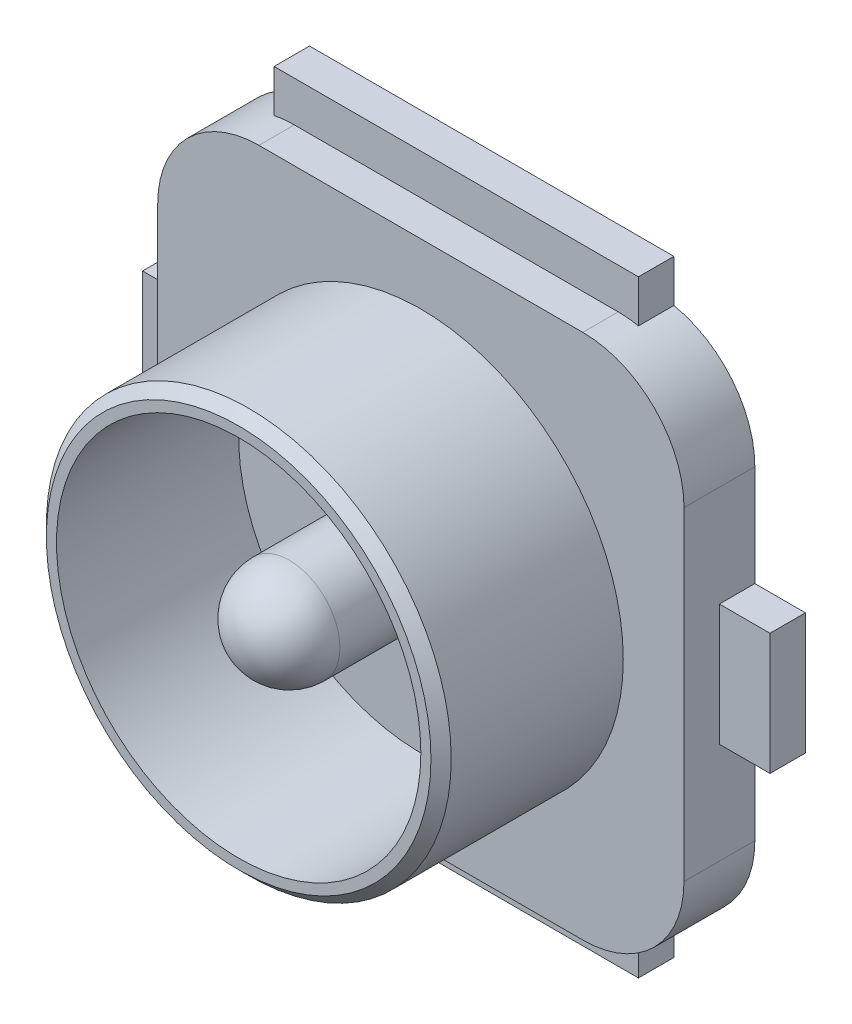
ISO-10303-21;
HEADER;
FILE_DESCRIPTION(('STEP AP214'),'2;1');
FILE_NAME('part.step','',(''),(''),'','','');
FILE_SCHEMA(('AUTOMOTIVE_DESIGN { 1 0 10303 214 1 1 1 1 }'));
ENDSEC;
DATA;
#1=APPLICATION_CONTEXT('core data for automotive mechanical design processes');
#2=APPLICATION_PROTOCOL_DEFINITION('international standard','automotive_design',2000,#1);
#3=PRODUCT_CONTEXT('',#1,'mechanical');
#4=PRODUCT('Part','Part','',(#3));
#5=PRODUCT_RELATED_PRODUCT_CATEGORY('part','',(#4));
#6=PRODUCT_DEFINITION_FORMATION('','',#4);
#7=PRODUCT_DEFINITION_CONTEXT('part definition',#1,'design');
#8=PRODUCT_DEFINITION('design','',#6,#7);
#9=PRODUCT_DEFINITION_SHAPE('','',#8);
#10=(LENGTH_UNIT() NAMED_UNIT(*) SI_UNIT(.MILLI.,.METRE.));
#11=(NAMED_UNIT(*) PLANE_ANGLE_UNIT() SI_UNIT($,.RADIAN.));
#12=(NAMED_UNIT(*) SI_UNIT($,.STERADIAN.) SOLID_ANGLE_UNIT());
#13=UNCERTAINTY_MEASURE_WITH_UNIT(LENGTH_MEASURE(1.E-05),#10,'distance_accuracy_value','');
#14=(GEOMETRIC_REPRESENTATION_CONTEXT(3) GLOBAL_UNCERTAINTY_ASSIGNED_CONTEXT((#13)) GLOBAL_UNIT_ASSIGNED_CONTEXT((#10,
#11,#12)) REPRESENTATION_CONTEXT('',''));
#15=CARTESIAN_POINT('',(0.,0.,0.));
#16=DIRECTION('',(0.,0.,1.));
#17=DIRECTION('',(1.,0.,0.));
#18=AXIS2_PLACEMENT_3D('',#15,#16,#17);
#19=CARTESIAN_POINT('',(14.95,23.45,0.8));
#20=DIRECTION('',(0.,0.,1.));
#21=DIRECTION('',(-0.707106781186551,0.707106781186544,0.));
#22=AXIS2_PLACEMENT_3D('',#19,#20,#21);
#23=CYLINDRICAL_SURFACE('',#22,0.5);
#24=CARTESIAN_POINT('',(14.95,23.45,1.15));
#25=DIRECTION('',(0.,0.,-1.));
#26=DIRECTION('',(-0.707106781186551,0.707106781186544,0.));
#27=AXIS2_PLACEMENT_3D('',#24,#25,#26);
#28=CIRCLE('',#27,0.5);
#29=CARTESIAN_POINT('',(14.45,23.45,1.15));
#30=VERTEX_POINT('',#29);
#31=CARTESIAN_POINT('',(14.95,23.95,1.15));
#32=VERTEX_POINT('',#31);
#33=EDGE_CURVE('E11',#30,#32,#28,.T.);
#34=ORIENTED_EDGE('',*,*,#33,.T.);
#35=DIRECTION('',(0.,0.,-1.));
#36=VECTOR('',#35,1.);
#37=CARTESIAN_POINT('',(14.95,23.95,0.8));
#38=LINE('',#37,#36);
#39=CARTESIAN_POINT('',(14.95,23.95,0.975));
#40=VERTEX_POINT('',#39);
#41=EDGE_CURVE('E24',#32,#40,#38,.T.);
#42=ORIENTED_EDGE('',*,*,#41,.T.);
#43=CARTESIAN_POINT('',(14.95,23.45,0.975));
#44=DIRECTION('',(0.,0.,-1.));
#45=DIRECTION('',(-0.707106781186551,0.707106781186544,0.));
#46=AXIS2_PLACEMENT_3D('',#43,#44,#45);
#47=CIRCLE('',#46,0.5);
#48=CARTESIAN_POINT('',(14.85,23.9398979485566,0.975));
#49=VERTEX_POINT('',#48);
#50=EDGE_CURVE('E428',#49,#40,#47,.T.);
#51=ORIENTED_EDGE('',*,*,#50,.F.);
#52=DIRECTION('',(0.,0.,1.));
#53=VECTOR('',#52,1.);
#54=CARTESIAN_POINT('',(14.85,23.9398979485566,0.8));
#55=LINE('',#54,#53);
#56=CARTESIAN_POINT('',(14.85,23.9398979485566,0.8));
#57=VERTEX_POINT('',#56);
#58=EDGE_CURVE('E425',#57,#49,#55,.T.);
#59=ORIENTED_EDGE('',*,*,#58,.F.);
#60=CARTESIAN_POINT('',(14.95,23.45,0.8));
#61=DIRECTION('',(0.,0.,1.));
#62=DIRECTION('',(-0.707106781186551,0.707106781186544,0.));
#63=AXIS2_PLACEMENT_3D('',#60,#61,#62);
#64=CIRCLE('',#63,0.5);
#65=CARTESIAN_POINT('',(14.45,23.45,0.8));
#66=VERTEX_POINT('',#65);
#67=EDGE_CURVE('E423',#57,#66,#64,.T.);
#68=ORIENTED_EDGE('',*,*,#67,.T.);
#69=DIRECTION('',(0.,0.,1.));
#70=VECTOR('',#69,1.);
#71=CARTESIAN_POINT('',(14.45,23.45,0.8));
#72=LINE('',#71,#70);
#73=EDGE_CURVE('E421',#66,#30,#72,.T.);
#74=ORIENTED_EDGE('',*,*,#73,.T.);
#75=EDGE_LOOP('',(#34,#42,#51,#59,#68,#74));
#76=FACE_BOUND('',#75,.T.);
#77=ADVANCED_FACE('F17',(#76),#23,.T.);
#78=CARTESIAN_POINT('',(15.75,22.65,1.15));
#79=DIRECTION('',(0.,0.,1.));
#80=DIRECTION('',(1.,0.,0.));
#81=AXIS2_PLACEMENT_3D('',#78,#79,#80);
#82=PLANE('',#81);
#83=ORIENTED_EDGE('',*,*,#33,.F.);
#84=DIRECTION('',(0.,-1.,0.));
#85=VECTOR('',#84,1.);
#86=CARTESIAN_POINT('',(14.45,21.35,1.15));
#87=LINE('',#86,#85);
#88=CARTESIAN_POINT('',(14.45,21.85,1.15));
#89=VERTEX_POINT('',#88);
#90=EDGE_CURVE('E419',#30,#89,#87,.T.);
#91=ORIENTED_EDGE('',*,*,#90,.T.);
#92=CARTESIAN_POINT('',(14.95,21.85,1.15));
#93=DIRECTION('',(0.,0.,-1.));
#94=DIRECTION('',(-0.707106781186548,-0.707106781186548,0.));
#95=AXIS2_PLACEMENT_3D('',#92,#93,#94);
#96=CIRCLE('',#95,0.5);
#97=CARTESIAN_POINT('',(14.95,21.35,1.15));
#98=VERTEX_POINT('',#97);
#99=EDGE_CURVE('E416',#98,#89,#96,.T.);
#100=ORIENTED_EDGE('',*,*,#99,.F.);
#101=DIRECTION('',(1.,0.,0.));
#102=VECTOR('',#101,1.);
#103=CARTESIAN_POINT('',(17.05,21.35,1.15));
#104=LINE('',#103,#102);
#105=CARTESIAN_POINT('',(16.55,21.35,1.15));
#106=VERTEX_POINT('',#105);
#107=EDGE_CURVE('E414',#98,#106,#104,.T.);
#108=ORIENTED_EDGE('',*,*,#107,.T.);
#109=CARTESIAN_POINT('',(16.55,21.85,1.15));
#110=DIRECTION('',(0.,0.,-1.));
#111=DIRECTION('',(0.707106781186551,-0.707106781186544,0.));
#112=AXIS2_PLACEMENT_3D('',#109,#110,#111);
#113=CIRCLE('',#112,0.5);
#114=CARTESIAN_POINT('',(17.05,21.85,1.15));
#115=VERTEX_POINT('',#114);
#116=EDGE_CURVE('E411',#115,#106,#113,.T.);
#117=ORIENTED_EDGE('',*,*,#116,.F.);
#118=DIRECTION('',(0.,1.,0.));
#119=VECTOR('',#118,1.);
#120=CARTESIAN_POINT('',(17.05,23.95,1.15));
#121=LINE('',#120,#119);
#122=CARTESIAN_POINT('',(17.05,23.45,1.15));
#123=VERTEX_POINT('',#122);
#124=EDGE_CURVE('E409',#115,#123,#121,.T.);
#125=ORIENTED_EDGE('',*,*,#124,.T.);
#126=CARTESIAN_POINT('',(16.55,23.45,1.15));
#127=DIRECTION('',(0.,0.,-1.));
#128=DIRECTION('',(0.707106781186548,0.707106781186548,0.));
#129=AXIS2_PLACEMENT_3D('',#126,#127,#128);
#130=CIRCLE('',#129,0.5);
#131=CARTESIAN_POINT('',(16.55,23.95,1.15));
#132=VERTEX_POINT('',#131);
#133=EDGE_CURVE('E406',#132,#123,#130,.T.);
#134=ORIENTED_EDGE('',*,*,#133,.F.);
#135=DIRECTION('',(-1.,0.,0.));
#136=VECTOR('',#135,1.);
#137=CARTESIAN_POINT('',(15.75,23.95,1.15));
#138=LINE('',#137,#136);
#139=EDGE_CURVE('E404',#132,#32,#138,.T.);
#140=ORIENTED_EDGE('',*,*,#139,.T.);
#141=EDGE_LOOP('',(#83,#91,#100,#108,#117,#125,#134,#140));
#142=FACE_BOUND('',#141,.T.);
#143=CARTESIAN_POINT('',(15.7499996479601,22.649999493733,1.15));
#144=DIRECTION('',(0.,0.,-1.));
#145=DIRECTION('',(-1.,0.,0.));
#146=AXIS2_PLACEMENT_3D('',#143,#144,#145);
#147=CIRCLE('',#146,1.);
#148=CARTESIAN_POINT('',(16.7499996479601,22.649999493733,1.15));
#149=VERTEX_POINT('',#148);
#150=EDGE_CURVE('E402',#149,#149,#147,.T.);
#151=ORIENTED_EDGE('',*,*,#150,.T.);
#152=EDGE_LOOP('',(#151));
#153=FACE_BOUND('',#152,.T.);
#154=ADVANCED_FACE('F486',(#142,#153),#82,.T.);
#155=CARTESIAN_POINT('',(14.45,23.95,0.8));
#156=DIRECTION('',(-1.,0.,0.));
#157=DIRECTION('',(0.,-1.,0.));
#158=AXIS2_PLACEMENT_3D('',#155,#156,#157);
#159=PLANE('',#158);
#160=ORIENTED_EDGE('',*,*,#73,.F.);
#161=DIRECTION('',(0.,1.,0.));
#162=VECTOR('',#161,1.);
#163=CARTESIAN_POINT('',(14.45,21.35,0.8));
#164=LINE('',#163,#162);
#165=CARTESIAN_POINT('',(14.45,22.95,0.8));
#166=VERTEX_POINT('',#165);
#167=EDGE_CURVE('E399',#166,#66,#164,.T.);
#168=ORIENTED_EDGE('',*,*,#167,.F.);
#169=DIRECTION('',(0.,0.,1.));
#170=VECTOR('',#169,1.);
#171=CARTESIAN_POINT('',(14.45,22.95,0.8));
#172=LINE('',#171,#170);
#173=CARTESIAN_POINT('',(14.45,22.95,0.975));
#174=VERTEX_POINT('',#173);
#175=EDGE_CURVE('E397',#166,#174,#172,.T.);
#176=ORIENTED_EDGE('',*,*,#175,.T.);
#177=DIRECTION('',(0.,-1.,0.));
#178=VECTOR('',#177,1.);
#179=CARTESIAN_POINT('',(14.45,23.3,0.975));
#180=LINE('',#179,#178);
#181=CARTESIAN_POINT('',(14.45,22.35,0.975));
#182=VERTEX_POINT('',#181);
#183=EDGE_CURVE('E395',#174,#182,#180,.T.);
#184=ORIENTED_EDGE('',*,*,#183,.T.);
#185=DIRECTION('',(0.,0.,-1.));
#186=VECTOR('',#185,1.);
#187=CARTESIAN_POINT('',(14.45,22.35,0.8));
#188=LINE('',#187,#186);
#189=CARTESIAN_POINT('',(14.45,22.35,0.8));
#190=VERTEX_POINT('',#189);
#191=EDGE_CURVE('E393',#182,#190,#188,.T.);
#192=ORIENTED_EDGE('',*,*,#191,.T.);
#193=DIRECTION('',(0.,1.,0.));
#194=VECTOR('',#193,1.);
#195=CARTESIAN_POINT('',(14.45,21.35,0.8));
#196=LINE('',#195,#194);
#197=CARTESIAN_POINT('',(14.45,21.85,0.8));
#198=VERTEX_POINT('',#197);
#199=EDGE_CURVE('E390',#198,#190,#196,.T.);
#200=ORIENTED_EDGE('',*,*,#199,.F.);
#201=DIRECTION('',(0.,0.,-1.));
#202=VECTOR('',#201,1.);
#203=CARTESIAN_POINT('',(14.45,21.85,0.8));
#204=LINE('',#203,#202);
#205=EDGE_CURVE('E387',#89,#198,#204,.T.);
#206=ORIENTED_EDGE('',*,*,#205,.F.);
#207=ORIENTED_EDGE('',*,*,#90,.F.);
#208=EDGE_LOOP('',(#160,#168,#176,#184,#192,#200,#206,#207));
#209=FACE_BOUND('',#208,.T.);
#210=ADVANCED_FACE('F457',(#209),#159,.T.);
#211=CARTESIAN_POINT('',(15.75,21.25,0.8));
#212=DIRECTION('',(0.,0.,1.));
#213=DIRECTION('',(-1.,0.,0.));
#214=AXIS2_PLACEMENT_3D('',#211,#212,#213);
#215=PLANE('',#214);
#216=ORIENTED_EDGE('',*,*,#67,.F.);
#217=DIRECTION('',(0.,-1.,0.));
#218=VECTOR('',#217,1.);
#219=CARTESIAN_POINT('',(14.85,22.7,0.8));
#220=LINE('',#219,#218);
#221=CARTESIAN_POINT('',(14.85,24.15,0.8));
#222=VERTEX_POINT('',#221);
#223=EDGE_CURVE('E384',#222,#57,#220,.T.);
#224=ORIENTED_EDGE('',*,*,#223,.F.);
#225=DIRECTION('',(1.,0.,0.));
#226=VECTOR('',#225,1.);
#227=CARTESIAN_POINT('',(14.85,24.15,0.8));
#228=LINE('',#227,#226);
#229=CARTESIAN_POINT('',(16.65,24.15,0.8));
#230=VERTEX_POINT('',#229);
#231=EDGE_CURVE('E382',#222,#230,#228,.T.);
#232=ORIENTED_EDGE('',*,*,#231,.T.);
#233=DIRECTION('',(0.,1.,0.));
#234=VECTOR('',#233,1.);
#235=CARTESIAN_POINT('',(16.65,22.6,0.8));
#236=LINE('',#235,#234);
#237=CARTESIAN_POINT('',(16.65,23.9398979485566,0.8));
#238=VERTEX_POINT('',#237);
#239=EDGE_CURVE('E379',#238,#230,#236,.T.);
#240=ORIENTED_EDGE('',*,*,#239,.F.);
#241=CARTESIAN_POINT('',(16.55,23.45,0.8));
#242=DIRECTION('',(0.,0.,1.));
#243=DIRECTION('',(0.707106781186548,0.707106781186548,0.));
#244=AXIS2_PLACEMENT_3D('',#241,#242,#243);
#245=CIRCLE('',#244,0.5);
#246=CARTESIAN_POINT('',(17.05,23.45,0.8));
#247=VERTEX_POINT('',#246);
#248=EDGE_CURVE('E376',#247,#238,#245,.T.);
#249=ORIENTED_EDGE('',*,*,#248,.F.);
#250=DIRECTION('',(0.,-1.,0.));
#251=VECTOR('',#250,1.);
#252=CARTESIAN_POINT('',(17.05,23.95,0.8));
#253=LINE('',#252,#251);
#254=CARTESIAN_POINT('',(17.05,22.95,0.8));
#255=VERTEX_POINT('',#254);
#256=EDGE_CURVE('E374',#247,#255,#253,.T.);
#257=ORIENTED_EDGE('',*,*,#256,.T.);
#258=DIRECTION('',(-1.,0.,0.));
#259=VECTOR('',#258,1.);
#260=CARTESIAN_POINT('',(17.3,22.95,0.8));
#261=LINE('',#260,#259);
#262=CARTESIAN_POINT('',(17.3,22.95,0.8));
#263=VERTEX_POINT('',#262);
#264=EDGE_CURVE('E371',#263,#255,#261,.T.);
#265=ORIENTED_EDGE('',*,*,#264,.F.);
#266=DIRECTION('',(0.,1.,0.));
#267=VECTOR('',#266,1.);
#268=CARTESIAN_POINT('',(17.3,22.35,0.8));
#269=LINE('',#268,#267);
#270=CARTESIAN_POINT('',(17.3,22.35,0.8));
#271=VERTEX_POINT('',#270);
#272=EDGE_CURVE('E368',#271,#263,#269,.T.);
#273=ORIENTED_EDGE('',*,*,#272,.F.);
#274=DIRECTION('',(1.,0.,0.));
#275=VECTOR('',#274,1.);
#276=CARTESIAN_POINT('',(17.05,22.35,0.8));
#277=LINE('',#276,#275);
#278=CARTESIAN_POINT('',(17.05,22.35,0.8));
#279=VERTEX_POINT('',#278);
#280=EDGE_CURVE('E365',#279,#271,#277,.T.);
#281=ORIENTED_EDGE('',*,*,#280,.F.);
#282=DIRECTION('',(0.,-1.,0.));
#283=VECTOR('',#282,1.);
#284=CARTESIAN_POINT('',(17.05,23.95,0.8));
#285=LINE('',#284,#283);
#286=CARTESIAN_POINT('',(17.05,21.85,0.8));
#287=VERTEX_POINT('',#286);
#288=EDGE_CURVE('E363',#279,#287,#285,.T.);
#289=ORIENTED_EDGE('',*,*,#288,.T.);
#290=CARTESIAN_POINT('',(16.55,21.85,0.8));
#291=DIRECTION('',(0.,0.,1.));
#292=DIRECTION('',(0.707106781186551,-0.707106781186544,0.));
#293=AXIS2_PLACEMENT_3D('',#290,#291,#292);
#294=CIRCLE('',#293,0.5);
#295=CARTESIAN_POINT('',(16.65,21.3601020514434,0.8));
#296=VERTEX_POINT('',#295);
#297=EDGE_CURVE('E360',#296,#287,#294,.T.);
#298=ORIENTED_EDGE('',*,*,#297,.F.);
#299=DIRECTION('',(0.,1.,0.));
#300=VECTOR('',#299,1.);
#301=CARTESIAN_POINT('',(16.65,21.15,0.8));
#302=LINE('',#301,#300);
#303=CARTESIAN_POINT('',(16.65,21.15,0.8));
#304=VERTEX_POINT('',#303);
#305=EDGE_CURVE('E357',#304,#296,#302,.T.);
#306=ORIENTED_EDGE('',*,*,#305,.F.);
#307=DIRECTION('',(1.,0.,0.));
#308=VECTOR('',#307,1.);
#309=CARTESIAN_POINT('',(14.85,21.15,0.8));
#310=LINE('',#309,#308);
#311=CARTESIAN_POINT('',(14.85,21.15,0.8));
#312=VERTEX_POINT('',#311);
#313=EDGE_CURVE('E355',#312,#304,#310,.T.);
#314=ORIENTED_EDGE('',*,*,#313,.F.);
#315=DIRECTION('',(0.,-1.,0.));
#316=VECTOR('',#315,1.);
#317=CARTESIAN_POINT('',(14.85,21.3,0.8));
#318=LINE('',#317,#316);
#319=CARTESIAN_POINT('',(14.85,21.3601020514434,0.8));
#320=VERTEX_POINT('',#319);
#321=EDGE_CURVE('E218',#320,#312,#318,.T.);
#322=ORIENTED_EDGE('',*,*,#321,.F.);
#323=CARTESIAN_POINT('',(14.95,21.85,0.8));
#324=DIRECTION('',(0.,0.,1.));
#325=DIRECTION('',(-0.707106781186548,-0.707106781186548,0.));
#326=AXIS2_PLACEMENT_3D('',#323,#324,#325);
#327=CIRCLE('',#326,0.5);
#328=EDGE_CURVE('E351',#198,#320,#327,.T.);
#329=ORIENTED_EDGE('',*,*,#328,.F.);
#330=ORIENTED_EDGE('',*,*,#199,.T.);
#331=DIRECTION('',(-1.,0.,0.));
#332=VECTOR('',#331,1.);
#333=CARTESIAN_POINT('',(14.45,22.35,0.8));
#334=LINE('',#333,#332);
#335=CARTESIAN_POINT('',(14.2,22.35,0.8));
#336=VERTEX_POINT('',#335);
#337=EDGE_CURVE('E349',#190,#336,#334,.T.);
#338=ORIENTED_EDGE('',*,*,#337,.T.);
#339=DIRECTION('',(0.,1.,0.));
#340=VECTOR('',#339,1.);
#341=CARTESIAN_POINT('',(14.2,22.35,0.8));
#342=LINE('',#341,#340);
#343=CARTESIAN_POINT('',(14.2,22.95,0.8));
#344=VERTEX_POINT('',#343);
#345=EDGE_CURVE('E347',#336,#344,#342,.T.);
#346=ORIENTED_EDGE('',*,*,#345,.T.);
#347=DIRECTION('',(1.,0.,0.));
#348=VECTOR('',#347,1.);
#349=CARTESIAN_POINT('',(14.2,22.95,0.8));
#350=LINE('',#349,#348);
#351=EDGE_CURVE('E344',#344,#166,#350,.T.);
#352=ORIENTED_EDGE('',*,*,#351,.T.);
#353=ORIENTED_EDGE('',*,*,#167,.T.);
#354=EDGE_LOOP('',(#216,#224,#232,#240,#249,#257,#265,#273,#281,#289,#298,#306,#314,#322,#329,
#330,#338,#346,#352,#353));
#355=FACE_BOUND('',#354,.T.);
#356=ADVANCED_FACE('F453',(#355),#215,.F.);
#357=CARTESIAN_POINT('',(14.95,21.85,0.8));
#358=DIRECTION('',(0.,0.,1.));
#359=DIRECTION('',(-0.707106781186548,-0.707106781186548,0.));
#360=AXIS2_PLACEMENT_3D('',#357,#358,#359);
#361=CYLINDRICAL_SURFACE('',#360,0.5);
#362=ORIENTED_EDGE('',*,*,#99,.T.);
#363=ORIENTED_EDGE('',*,*,#205,.T.);
#364=ORIENTED_EDGE('',*,*,#328,.T.);
#365=DIRECTION('',(0.,0.,-1.));
#366=VECTOR('',#365,1.);
#367=CARTESIAN_POINT('',(14.85,21.3601020514434,0.8));
#368=LINE('',#367,#366);
#369=CARTESIAN_POINT('',(14.85,21.3601020514434,0.975));
#370=VERTEX_POINT('',#369);
#371=EDGE_CURVE('E342',#370,#320,#368,.T.);
#372=ORIENTED_EDGE('',*,*,#371,.F.);
#373=CARTESIAN_POINT('',(14.95,21.85,0.975));
#374=DIRECTION('',(0.,0.,-1.));
#375=DIRECTION('',(-0.707106781186548,-0.707106781186548,0.));
#376=AXIS2_PLACEMENT_3D('',#373,#374,#375);
#377=CIRCLE('',#376,0.5);
#378=CARTESIAN_POINT('',(14.95,21.35,0.975));
#379=VERTEX_POINT('',#378);
#380=EDGE_CURVE('E223',#379,#370,#377,.T.);
#381=ORIENTED_EDGE('',*,*,#380,.F.);
#382=DIRECTION('',(0.,0.,1.));
#383=VECTOR('',#382,1.);
#384=CARTESIAN_POINT('',(14.95,21.35,0.8));
#385=LINE('',#384,#383);
#386=EDGE_CURVE('E338',#379,#98,#385,.T.);
#387=ORIENTED_EDGE('',*,*,#386,.T.);
#388=EDGE_LOOP('',(#362,#363,#364,#372,#381,#387));
#389=FACE_BOUND('',#388,.T.);
#390=ADVANCED_FACE('F498',(#389),#361,.T.);
#391=CARTESIAN_POINT('',(16.55,21.85,0.8));
#392=DIRECTION('',(0.,0.,1.));
#393=DIRECTION('',(0.707106781186551,-0.707106781186544,0.));
#394=AXIS2_PLACEMENT_3D('',#391,#392,#393);
#395=CYLINDRICAL_SURFACE('',#394,0.5);
#396=ORIENTED_EDGE('',*,*,#116,.T.);
#397=DIRECTION('',(0.,0.,-1.));
#398=VECTOR('',#397,1.);
#399=CARTESIAN_POINT('',(16.55,21.35,0.8));
#400=LINE('',#399,#398);
#401=CARTESIAN_POINT('',(16.55,21.35,0.975));
#402=VERTEX_POINT('',#401);
#403=EDGE_CURVE('E336',#106,#402,#400,.T.);
#404=ORIENTED_EDGE('',*,*,#403,.T.);
#405=CARTESIAN_POINT('',(16.55,21.85,0.975));
#406=DIRECTION('',(0.,0.,-1.));
#407=DIRECTION('',(0.707106781186551,-0.707106781186544,0.));
#408=AXIS2_PLACEMENT_3D('',#405,#406,#407);
#409=CIRCLE('',#408,0.5);
#410=CARTESIAN_POINT('',(16.65,21.3601020514434,0.975));
#411=VERTEX_POINT('',#410);
#412=EDGE_CURVE('E333',#411,#402,#409,.T.);
#413=ORIENTED_EDGE('',*,*,#412,.F.);
#414=DIRECTION('',(0.,0.,1.));
#415=VECTOR('',#414,1.);
#416=CARTESIAN_POINT('',(16.65,21.3601020514434,0.8));
#417=LINE('',#416,#415);
#418=EDGE_CURVE('E330',#296,#411,#417,.T.);
#419=ORIENTED_EDGE('',*,*,#418,.F.);
#420=ORIENTED_EDGE('',*,*,#297,.T.);
#421=DIRECTION('',(0.,0.,1.));
#422=VECTOR('',#421,1.);
#423=CARTESIAN_POINT('',(17.05,21.85,0.8));
#424=LINE('',#423,#422);
#425=EDGE_CURVE('E327',#287,#115,#424,.T.);
#426=ORIENTED_EDGE('',*,*,#425,.T.);
#427=EDGE_LOOP('',(#396,#404,#413,#419,#420,#426));
#428=FACE_BOUND('',#427,.T.);
#429=ADVANCED_FACE('F501',(#428),#395,.T.);
#430=CARTESIAN_POINT('',(17.05,21.35,0.8));
#431=DIRECTION('',(1.,0.,0.));
#432=DIRECTION('',(0.,1.,0.));
#433=AXIS2_PLACEMENT_3D('',#430,#431,#432);
#434=PLANE('',#433);
#435=ORIENTED_EDGE('',*,*,#425,.F.);
#436=ORIENTED_EDGE('',*,*,#288,.F.);
#437=DIRECTION('',(0.,0.,1.));
#438=VECTOR('',#437,1.);
#439=CARTESIAN_POINT('',(17.05,22.35,0.8));
#440=LINE('',#439,#438);
#441=CARTESIAN_POINT('',(17.05,22.35,0.975));
#442=VERTEX_POINT('',#441);
#443=EDGE_CURVE('E325',#279,#442,#440,.T.);
#444=ORIENTED_EDGE('',*,*,#443,.T.);
#445=DIRECTION('',(0.,1.,0.));
#446=VECTOR('',#445,1.);
#447=CARTESIAN_POINT('',(17.05,22.,0.975));
#448=LINE('',#447,#446);
#449=CARTESIAN_POINT('',(17.05,22.95,0.975));
#450=VERTEX_POINT('',#449);
#451=EDGE_CURVE('E323',#442,#450,#448,.T.);
#452=ORIENTED_EDGE('',*,*,#451,.T.);
#453=DIRECTION('',(0.,0.,-1.));
#454=VECTOR('',#453,1.);
#455=CARTESIAN_POINT('',(17.05,22.95,0.8));
#456=LINE('',#455,#454);
#457=EDGE_CURVE('E320',#450,#255,#456,.T.);
#458=ORIENTED_EDGE('',*,*,#457,.T.);
#459=ORIENTED_EDGE('',*,*,#256,.F.);
#460=DIRECTION('',(0.,0.,-1.));
#461=VECTOR('',#460,1.);
#462=CARTESIAN_POINT('',(17.05,23.45,0.8));
#463=LINE('',#462,#461);
#464=EDGE_CURVE('E317',#123,#247,#463,.T.);
#465=ORIENTED_EDGE('',*,*,#464,.F.);
#466=ORIENTED_EDGE('',*,*,#124,.F.);
#467=EDGE_LOOP('',(#435,#436,#444,#452,#458,#459,#465,#466));
#468=FACE_BOUND('',#467,.T.);
#469=ADVANCED_FACE('F505',(#468),#434,.T.);
#470=CARTESIAN_POINT('',(16.55,23.45,0.8));
#471=DIRECTION('',(0.,0.,1.));
#472=DIRECTION('',(0.707106781186548,0.707106781186548,0.));
#473=AXIS2_PLACEMENT_3D('',#470,#471,#472);
#474=CYLINDRICAL_SURFACE('',#473,0.5);
#475=ORIENTED_EDGE('',*,*,#133,.T.);
#476=ORIENTED_EDGE('',*,*,#464,.T.);
#477=ORIENTED_EDGE('',*,*,#248,.T.);
#478=DIRECTION('',(0.,0.,-1.));
#479=VECTOR('',#478,1.);
#480=CARTESIAN_POINT('',(16.65,23.9398979485566,0.8));
#481=LINE('',#480,#479);
#482=CARTESIAN_POINT('',(16.65,23.9398979485566,0.975));
#483=VERTEX_POINT('',#482);
#484=EDGE_CURVE('E314',#483,#238,#481,.T.);
#485=ORIENTED_EDGE('',*,*,#484,.F.);
#486=CARTESIAN_POINT('',(16.55,23.45,0.975));
#487=DIRECTION('',(0.,0.,-1.));
#488=DIRECTION('',(0.707106781186548,0.707106781186548,0.));
#489=AXIS2_PLACEMENT_3D('',#486,#487,#488);
#490=CIRCLE('',#489,0.5);
#491=CARTESIAN_POINT('',(16.55,23.95,0.975));
#492=VERTEX_POINT('',#491);
#493=EDGE_CURVE('E311',#492,#483,#490,.T.);
#494=ORIENTED_EDGE('',*,*,#493,.F.);
#495=DIRECTION('',(0.,0.,1.));
#496=VECTOR('',#495,1.);
#497=CARTESIAN_POINT('',(16.55,23.95,0.8));
#498=LINE('',#497,#496);
#499=EDGE_CURVE('E308',#492,#132,#498,.T.);
#500=ORIENTED_EDGE('',*,*,#499,.T.);
#501=EDGE_LOOP('',(#475,#476,#477,#485,#494,#500));
#502=FACE_BOUND('',#501,.T.);
#503=ADVANCED_FACE('F438',(#502),#474,.T.);
#504=CARTESIAN_POINT('',(15.7499996479601,22.649999493733,1.8));
#505=DIRECTION('',(0.,0.,1.));
#506=DIRECTION('',(1.,0.,0.));
#507=AXIS2_PLACEMENT_3D('',#504,#505,#506);
#508=SPHERICAL_SURFACE('',#507,0.25);
#509=CARTESIAN_POINT('',(15.7499996479601,22.649999493733,1.8));
#510=DIRECTION('',(0.,0.,1.));
#511=DIRECTION('',(-1.,0.,0.));
#512=AXIS2_PLACEMENT_3D('',#509,#510,#511);
#513=CIRCLE('',#512,0.249999999999999);
#514=CARTESIAN_POINT('',(15.9999996479601,22.649999493733,1.8));
#515=VERTEX_POINT('',#514);
#516=CARTESIAN_POINT('',(15.4999996479601,22.649999493733,1.8));
#517=VERTEX_POINT('',#516);
#518=EDGE_CURVE('E306',#515,#517,#513,.T.);
#519=ORIENTED_EDGE('',*,*,#518,.T.);
#520=CARTESIAN_POINT('',(15.7499996479601,22.649999493733,1.8));
#521=DIRECTION('',(0.,-1.,0.));
#522=DIRECTION('',(-1.,0.,0.));
#523=AXIS2_PLACEMENT_3D('',#520,#521,#522);
#524=CIRCLE('',#523,0.249999999999999);
#525=CARTESIAN_POINT('',(15.7499996479601,22.649999493733,2.05));
#526=VERTEX_POINT('',#525);
#527=EDGE_CURVE('E303',#526,#517,#524,.T.);
#528=ORIENTED_EDGE('',*,*,#527,.F.);
#529=ORIENTED_EDGE('',*,*,#527,.T.);
#530=CARTESIAN_POINT('',(15.7499996479601,22.649999493733,1.8));
#531=DIRECTION('',(0.,0.,1.));
#532=DIRECTION('',(-1.,0.,0.));
#533=AXIS2_PLACEMENT_3D('',#530,#531,#532);
#534=CIRCLE('',#533,0.249999999999999);
#535=EDGE_CURVE('E300',#517,#515,#534,.T.);
#536=ORIENTED_EDGE('',*,*,#535,.T.);
#537=EDGE_LOOP('',(#519,#528,#529,#536));
#538=FACE_BOUND('',#537,.T.);
#539=ADVANCED_FACE('F512',(#538),#508,.T.);
#540=CARTESIAN_POINT('',(15.7499996479601,22.649999493733,1.15));
#541=DIRECTION('',(0.,0.,1.));
#542=DIRECTION('',(-1.,0.,0.));
#543=AXIS2_PLACEMENT_3D('',#540,#541,#542);
#544=CYLINDRICAL_SURFACE('',#543,0.249999999999999);
#545=ORIENTED_EDGE('',*,*,#518,.F.);
#546=DIRECTION('',(0.,0.,-1.));
#547=VECTOR('',#546,1.);
#548=CARTESIAN_POINT('',(15.9999996479601,22.649999493733,1.15));
#549=LINE('',#548,#547);
#550=CARTESIAN_POINT('',(15.9999996479601,22.649999493733,1.15));
#551=VERTEX_POINT('',#550);
#552=EDGE_CURVE('E298',#515,#551,#549,.T.);
#553=ORIENTED_EDGE('',*,*,#552,.T.);
#554=CARTESIAN_POINT('',(15.7499996479601,22.649999493733,1.15));
#555=DIRECTION('',(0.,0.,-1.));
#556=DIRECTION('',(-1.,0.,0.));
#557=AXIS2_PLACEMENT_3D('',#554,#555,#556);
#558=CIRCLE('',#557,0.249999999999999);
#559=EDGE_CURVE('E295',#551,#551,#558,.T.);
#560=ORIENTED_EDGE('',*,*,#559,.F.);
#561=ORIENTED_EDGE('',*,*,#552,.F.);
#562=ORIENTED_EDGE('',*,*,#535,.F.);
#563=EDGE_LOOP('',(#545,#553,#560,#561,#562));
#564=FACE_BOUND('',#563,.T.);
#565=ADVANCED_FACE('F515',(#564),#544,.T.);
#566=CARTESIAN_POINT('',(15.7499996479601,22.649999493733,2.025));
#567=DIRECTION('',(0.,0.,-1.));
#568=DIRECTION('',(-1.,0.,0.));
#569=AXIS2_PLACEMENT_3D('',#566,#567,#568);
#570=CONICAL_SURFACE('',#569,0.975000000000001,0.785398163397437);
#571=CARTESIAN_POINT('',(15.7499996479601,22.649999493733,2.05));
#572=DIRECTION('',(0.,0.,-1.));
#573=DIRECTION('',(-1.,0.,0.));
#574=AXIS2_PLACEMENT_3D('',#571,#572,#573);
#575=CIRCLE('',#574,0.950000000000002);
#576=CARTESIAN_POINT('',(16.6999996479601,22.649999493733,2.05));
#577=VERTEX_POINT('',#576);
#578=EDGE_CURVE('E293',#577,#577,#575,.T.);
#579=ORIENTED_EDGE('',*,*,#578,.T.);
#580=DIRECTION('',(0.70710678118654,0.,-0.707106781186555));
#581=VECTOR('',#580,1.);
#582=CARTESIAN_POINT('',(16.7249996479601,22.649999493733,2.025));
#583=LINE('',#582,#581);
#584=CARTESIAN_POINT('',(16.7499996479601,22.649999493733,2.));
#585=VERTEX_POINT('',#584);
#586=EDGE_CURVE('E291',#577,#585,#583,.T.);
#587=ORIENTED_EDGE('',*,*,#586,.T.);
#588=CARTESIAN_POINT('',(15.7499996479601,22.649999493733,2.));
#589=DIRECTION('',(0.,0.,1.));
#590=DIRECTION('',(-1.,0.,0.));
#591=AXIS2_PLACEMENT_3D('',#588,#589,#590);
#592=CIRCLE('',#591,1.);
#593=EDGE_CURVE('E288',#585,#585,#592,.T.);
#594=ORIENTED_EDGE('',*,*,#593,.T.);
#595=ORIENTED_EDGE('',*,*,#586,.F.);
#596=EDGE_LOOP('',(#579,#587,#594,#595));
#597=FACE_BOUND('',#596,.T.);
#598=ADVANCED_FACE('F519',(#597),#570,.T.);
#599=CARTESIAN_POINT('',(15.7499996479601,22.649999493733,1.15));
#600=DIRECTION('',(0.,0.,1.));
#601=DIRECTION('',(-1.,0.,0.));
#602=AXIS2_PLACEMENT_3D('',#599,#600,#601);
#603=CYLINDRICAL_SURFACE('',#602,1.);
#604=ORIENTED_EDGE('',*,*,#593,.F.);
#605=DIRECTION('',(0.,0.,-1.));
#606=VECTOR('',#605,1.);
#607=CARTESIAN_POINT('',(16.7499996479601,22.649999493733,1.15));
#608=LINE('',#607,#606);
#609=EDGE_CURVE('E285',#585,#149,#608,.T.);
#610=ORIENTED_EDGE('',*,*,#609,.T.);
#611=ORIENTED_EDGE('',*,*,#150,.F.);
#612=ORIENTED_EDGE('',*,*,#609,.F.);
#613=EDGE_LOOP('',(#604,#610,#611,#612));
#614=FACE_BOUND('',#613,.T.);
#615=ADVANCED_FACE('F523',(#614),#603,.T.);
#616=CARTESIAN_POINT('',(15.7499996479601,22.649999493733,2.05));
#617=DIRECTION('',(0.,0.,1.));
#618=DIRECTION('',(-1.,0.,0.));
#619=AXIS2_PLACEMENT_3D('',#616,#617,#618);
#620=PLANE('',#619);
#621=ORIENTED_EDGE('',*,*,#578,.F.);
#622=EDGE_LOOP('',(#621));
#623=FACE_BOUND('',#622,.T.);
#624=CARTESIAN_POINT('',(15.7499996479601,22.649999493733,2.05));
#625=DIRECTION('',(0.,0.,-1.));
#626=DIRECTION('',(-1.,0.,0.));
#627=AXIS2_PLACEMENT_3D('',#624,#625,#626);
#628=CIRCLE('',#627,0.900000000000001);
#629=CARTESIAN_POINT('',(16.6499996479601,22.649999493733,2.05));
#630=VERTEX_POINT('',#629);
#631=EDGE_CURVE('E283',#630,#630,#628,.T.);
#632=ORIENTED_EDGE('',*,*,#631,.T.);
#633=EDGE_LOOP('',(#632));
#634=FACE_BOUND('',#633,.T.);
#635=ADVANCED_FACE('F527',(#623,#634),#620,.T.);
#636=CARTESIAN_POINT('',(15.7499996479601,22.649999493733,1.15));
#637=DIRECTION('',(0.,0.,1.));
#638=DIRECTION('',(-1.,0.,0.));
#639=AXIS2_PLACEMENT_3D('',#636,#637,#638);
#640=CYLINDRICAL_SURFACE('',#639,0.900000000000001);
#641=ORIENTED_EDGE('',*,*,#631,.F.);
#642=DIRECTION('',(0.,0.,-1.));
#643=VECTOR('',#642,1.);
#644=CARTESIAN_POINT('',(16.6499996479601,22.649999493733,1.15));
#645=LINE('',#644,#643);
#646=CARTESIAN_POINT('',(16.6499996479601,22.649999493733,1.15));
#647=VERTEX_POINT('',#646);
#648=EDGE_CURVE('E281',#630,#647,#645,.T.);
#649=ORIENTED_EDGE('',*,*,#648,.T.);
#650=CARTESIAN_POINT('',(15.7499996479601,22.649999493733,1.15));
#651=DIRECTION('',(0.,0.,1.));
#652=DIRECTION('',(-1.,0.,0.));
#653=AXIS2_PLACEMENT_3D('',#650,#651,#652);
#654=CIRCLE('',#653,0.900000000000001);
#655=EDGE_CURVE('E278',#647,#647,#654,.T.);
#656=ORIENTED_EDGE('',*,*,#655,.F.);
#657=ORIENTED_EDGE('',*,*,#648,.F.);
#658=EDGE_LOOP('',(#641,#649,#656,#657));
#659=FACE_BOUND('',#658,.T.);
#660=ADVANCED_FACE('F531',(#659),#640,.F.);
#661=CARTESIAN_POINT('',(17.3,22.35,0.8));
#662=DIRECTION('',(1.,0.,0.));
#663=DIRECTION('',(0.,1.,0.));
#664=AXIS2_PLACEMENT_3D('',#661,#662,#663);
#665=PLANE('',#664);
#666=ORIENTED_EDGE('',*,*,#272,.T.);
#667=DIRECTION('',(0.,0.,1.));
#668=VECTOR('',#667,1.);
#669=CARTESIAN_POINT('',(17.3,22.95,0.8));
#670=LINE('',#669,#668);
#671=CARTESIAN_POINT('',(17.3,22.95,0.975));
#672=VERTEX_POINT('',#671);
#673=EDGE_CURVE('E276',#263,#672,#670,.T.);
#674=ORIENTED_EDGE('',*,*,#673,.T.);
#675=DIRECTION('',(0.,1.,0.));
#676=VECTOR('',#675,1.);
#677=CARTESIAN_POINT('',(17.3,22.35,0.975));
#678=LINE('',#677,#676);
#679=CARTESIAN_POINT('',(17.3,22.35,0.975));
#680=VERTEX_POINT('',#679);
#681=EDGE_CURVE('E273',#680,#672,#678,.T.);
#682=ORIENTED_EDGE('',*,*,#681,.F.);
#683=DIRECTION('',(0.,0.,1.));
#684=VECTOR('',#683,1.);
#685=CARTESIAN_POINT('',(17.3,22.35,0.8));
#686=LINE('',#685,#684);
#687=EDGE_CURVE('E270',#271,#680,#686,.T.);
#688=ORIENTED_EDGE('',*,*,#687,.F.);
#689=EDGE_LOOP('',(#666,#674,#682,#688));
#690=FACE_BOUND('',#689,.T.);
#691=ADVANCED_FACE('F535',(#690),#665,.T.);
#692=CARTESIAN_POINT('',(17.05,22.35,0.8));
#693=DIRECTION('',(0.,-1.,0.));
#694=DIRECTION('',(1.,0.,0.));
#695=AXIS2_PLACEMENT_3D('',#692,#693,#694);
#696=PLANE('',#695);
#697=ORIENTED_EDGE('',*,*,#280,.T.);
#698=ORIENTED_EDGE('',*,*,#687,.T.);
#699=DIRECTION('',(1.,0.,0.));
#700=VECTOR('',#699,1.);
#701=CARTESIAN_POINT('',(17.05,22.35,0.975));
#702=LINE('',#701,#700);
#703=EDGE_CURVE('E267',#442,#680,#702,.T.);
#704=ORIENTED_EDGE('',*,*,#703,.F.);
#705=ORIENTED_EDGE('',*,*,#443,.F.);
#706=EDGE_LOOP('',(#697,#698,#704,#705));
#707=FACE_BOUND('',#706,.T.);
#708=ADVANCED_FACE('F539',(#707),#696,.T.);
#709=CARTESIAN_POINT('',(17.3,22.95,0.8));
#710=DIRECTION('',(0.,1.,0.));
#711=DIRECTION('',(-1.,0.,0.));
#712=AXIS2_PLACEMENT_3D('',#709,#710,#711);
#713=PLANE('',#712);
#714=ORIENTED_EDGE('',*,*,#264,.T.);
#715=ORIENTED_EDGE('',*,*,#457,.F.);
#716=DIRECTION('',(-1.,0.,0.));
#717=VECTOR('',#716,1.);
#718=CARTESIAN_POINT('',(17.3,22.95,0.975));
#719=LINE('',#718,#717);
#720=EDGE_CURVE('E264',#672,#450,#719,.T.);
#721=ORIENTED_EDGE('',*,*,#720,.F.);
#722=ORIENTED_EDGE('',*,*,#673,.F.);
#723=EDGE_LOOP('',(#714,#715,#721,#722));
#724=FACE_BOUND('',#723,.T.);
#725=ADVANCED_FACE('F543',(#724),#713,.T.);
#726=CARTESIAN_POINT('',(17.175,22.65,0.975));
#727=DIRECTION('',(0.,0.,1.));
#728=DIRECTION('',(1.,0.,0.));
#729=AXIS2_PLACEMENT_3D('',#726,#727,#728);
#730=PLANE('',#729);
#731=ORIENTED_EDGE('',*,*,#720,.T.);
#732=ORIENTED_EDGE('',*,*,#451,.F.);
#733=ORIENTED_EDGE('',*,*,#703,.T.);
#734=ORIENTED_EDGE('',*,*,#681,.T.);
#735=EDGE_LOOP('',(#731,#732,#733,#734));
#736=FACE_BOUND('',#735,.T.);
#737=ADVANCED_FACE('F483',(#736),#730,.T.);
#738=CARTESIAN_POINT('',(14.2,22.35,0.8));
#739=DIRECTION('',(0.,-1.,0.));
#740=DIRECTION('',(1.,0.,0.));
#741=AXIS2_PLACEMENT_3D('',#738,#739,#740);
#742=PLANE('',#741);
#743=ORIENTED_EDGE('',*,*,#337,.F.);
#744=ORIENTED_EDGE('',*,*,#191,.F.);
#745=DIRECTION('',(1.,0.,0.));
#746=VECTOR('',#745,1.);
#747=CARTESIAN_POINT('',(14.45,22.35,0.975));
#748=LINE('',#747,#746);
#749=CARTESIAN_POINT('',(14.2,22.35,0.975));
#750=VERTEX_POINT('',#749);
#751=EDGE_CURVE('E261',#750,#182,#748,.T.);
#752=ORIENTED_EDGE('',*,*,#751,.F.);
#753=DIRECTION('',(0.,0.,1.));
#754=VECTOR('',#753,1.);
#755=CARTESIAN_POINT('',(14.2,22.35,0.8));
#756=LINE('',#755,#754);
#757=EDGE_CURVE('E258',#336,#750,#756,.T.);
#758=ORIENTED_EDGE('',*,*,#757,.F.);
#759=EDGE_LOOP('',(#743,#744,#752,#758));
#760=FACE_BOUND('',#759,.T.);
#761=ADVANCED_FACE('F469',(#760),#742,.T.);
#762=CARTESIAN_POINT('',(14.2,22.95,0.8));
#763=DIRECTION('',(-1.,0.,0.));
#764=DIRECTION('',(0.,-1.,0.));
#765=AXIS2_PLACEMENT_3D('',#762,#763,#764);
#766=PLANE('',#765);
#767=ORIENTED_EDGE('',*,*,#345,.F.);
#768=ORIENTED_EDGE('',*,*,#757,.T.);
#769=DIRECTION('',(0.,-1.,0.));
#770=VECTOR('',#769,1.);
#771=CARTESIAN_POINT('',(14.2,22.35,0.975));
#772=LINE('',#771,#770);
#773=CARTESIAN_POINT('',(14.2,22.95,0.975));
#774=VERTEX_POINT('',#773);
#775=EDGE_CURVE('E255',#774,#750,#772,.T.);
#776=ORIENTED_EDGE('',*,*,#775,.F.);
#777=DIRECTION('',(0.,0.,1.));
#778=VECTOR('',#777,1.);
#779=CARTESIAN_POINT('',(14.2,22.95,0.8));
#780=LINE('',#779,#778);
#781=EDGE_CURVE('E252',#344,#774,#780,.T.);
#782=ORIENTED_EDGE('',*,*,#781,.F.);
#783=EDGE_LOOP('',(#767,#768,#776,#782));
#784=FACE_BOUND('',#783,.T.);
#785=ADVANCED_FACE('F474',(#784),#766,.T.);
#786=CARTESIAN_POINT('',(14.45,22.95,0.8));
#787=DIRECTION('',(0.,1.,0.));
#788=DIRECTION('',(-1.,0.,0.));
#789=AXIS2_PLACEMENT_3D('',#786,#787,#788);
#790=PLANE('',#789);
#791=ORIENTED_EDGE('',*,*,#351,.F.);
#792=ORIENTED_EDGE('',*,*,#781,.T.);
#793=DIRECTION('',(-1.,0.,0.));
#794=VECTOR('',#793,1.);
#795=CARTESIAN_POINT('',(14.2,22.95,0.975));
#796=LINE('',#795,#794);
#797=EDGE_CURVE('E249',#174,#774,#796,.T.);
#798=ORIENTED_EDGE('',*,*,#797,.F.);
#799=ORIENTED_EDGE('',*,*,#175,.F.);
#800=EDGE_LOOP('',(#791,#792,#798,#799));
#801=FACE_BOUND('',#800,.T.);
#802=ADVANCED_FACE('F462',(#801),#790,.T.);
#803=CARTESIAN_POINT('',(14.325,22.65,0.975));
#804=DIRECTION('',(0.,0.,1.));
#805=DIRECTION('',(1.,0.,0.));
#806=AXIS2_PLACEMENT_3D('',#803,#804,#805);
#807=PLANE('',#806);
#808=ORIENTED_EDGE('',*,*,#183,.F.);
#809=ORIENTED_EDGE('',*,*,#797,.T.);
#810=ORIENTED_EDGE('',*,*,#775,.T.);
#811=ORIENTED_EDGE('',*,*,#751,.T.);
#812=EDGE_LOOP('',(#808,#809,#810,#811));
#813=FACE_BOUND('',#812,.T.);
#814=ADVANCED_FACE('F465',(#813),#807,.T.);
#815=CARTESIAN_POINT('',(14.85,24.15,0.8));
#816=DIRECTION('',(-1.,0.,0.));
#817=DIRECTION('',(0.,-1.,0.));
#818=AXIS2_PLACEMENT_3D('',#815,#816,#817);
#819=PLANE('',#818);
#820=ORIENTED_EDGE('',*,*,#223,.T.);
#821=ORIENTED_EDGE('',*,*,#58,.T.);
#822=DIRECTION('',(0.,-1.,0.));
#823=VECTOR('',#822,1.);
#824=CARTESIAN_POINT('',(14.85,23.95,0.975));
#825=LINE('',#824,#823);
#826=CARTESIAN_POINT('',(14.85,24.15,0.975));
#827=VERTEX_POINT('',#826);
#828=EDGE_CURVE('E246',#827,#49,#825,.T.);
#829=ORIENTED_EDGE('',*,*,#828,.F.);
#830=DIRECTION('',(0.,0.,1.));
#831=VECTOR('',#830,1.);
#832=CARTESIAN_POINT('',(14.85,24.15,0.8));
#833=LINE('',#832,#831);
#834=EDGE_CURVE('E243',#222,#827,#833,.T.);
#835=ORIENTED_EDGE('',*,*,#834,.F.);
#836=EDGE_LOOP('',(#820,#821,#829,#835));
#837=FACE_BOUND('',#836,.T.);
#838=ADVANCED_FACE('F449',(#837),#819,.T.);
#839=CARTESIAN_POINT('',(16.65,24.15,0.8));
#840=DIRECTION('',(0.,1.,0.));
#841=DIRECTION('',(-1.,0.,0.));
#842=AXIS2_PLACEMENT_3D('',#839,#840,#841);
#843=PLANE('',#842);
#844=ORIENTED_EDGE('',*,*,#231,.F.);
#845=ORIENTED_EDGE('',*,*,#834,.T.);
#846=DIRECTION('',(-1.,0.,0.));
#847=VECTOR('',#846,1.);
#848=CARTESIAN_POINT('',(14.85,24.15,0.975));
#849=LINE('',#848,#847);
#850=CARTESIAN_POINT('',(16.65,24.15,0.975));
#851=VERTEX_POINT('',#850);
#852=EDGE_CURVE('E240',#851,#827,#849,.T.);
#853=ORIENTED_EDGE('',*,*,#852,.F.);
#854=DIRECTION('',(0.,0.,1.));
#855=VECTOR('',#854,1.);
#856=CARTESIAN_POINT('',(16.65,24.15,0.8));
#857=LINE('',#856,#855);
#858=EDGE_CURVE('E237',#230,#851,#857,.T.);
#859=ORIENTED_EDGE('',*,*,#858,.F.);
#860=EDGE_LOOP('',(#844,#845,#853,#859));
#861=FACE_BOUND('',#860,.T.);
#862=ADVANCED_FACE('F446',(#861),#843,.T.);
#863=CARTESIAN_POINT('',(16.65,23.95,0.8));
#864=DIRECTION('',(1.,0.,0.));
#865=DIRECTION('',(0.,1.,0.));
#866=AXIS2_PLACEMENT_3D('',#863,#864,#865);
#867=PLANE('',#866);
#868=ORIENTED_EDGE('',*,*,#239,.T.);
#869=ORIENTED_EDGE('',*,*,#858,.T.);
#870=DIRECTION('',(0.,1.,0.));
#871=VECTOR('',#870,1.);
#872=CARTESIAN_POINT('',(16.65,24.,0.975));
#873=LINE('',#872,#871);
#874=EDGE_CURVE('E234',#483,#851,#873,.T.);
#875=ORIENTED_EDGE('',*,*,#874,.F.);
#876=ORIENTED_EDGE('',*,*,#484,.T.);
#877=EDGE_LOOP('',(#868,#869,#875,#876));
#878=FACE_BOUND('',#877,.T.);
#879=ADVANCED_FACE('F442',(#878),#867,.T.);
#880=CARTESIAN_POINT('',(15.75,24.05,0.975));
#881=DIRECTION('',(0.,0.,1.));
#882=DIRECTION('',(1.,0.,0.));
#883=AXIS2_PLACEMENT_3D('',#880,#881,#882);
#884=PLANE('',#883);
#885=ORIENTED_EDGE('',*,*,#874,.T.);
#886=ORIENTED_EDGE('',*,*,#852,.T.);
#887=ORIENTED_EDGE('',*,*,#828,.T.);
#888=ORIENTED_EDGE('',*,*,#50,.T.);
#889=DIRECTION('',(-1.,0.,0.));
#890=VECTOR('',#889,1.);
#891=CARTESIAN_POINT('',(16.4,23.95,0.975));
#892=LINE('',#891,#890);
#893=EDGE_CURVE('E231',#492,#40,#892,.T.);
#894=ORIENTED_EDGE('',*,*,#893,.F.);
#895=ORIENTED_EDGE('',*,*,#493,.T.);
#896=EDGE_LOOP('',(#885,#886,#887,#888,#894,#895));
#897=FACE_BOUND('',#896,.T.);
#898=ADVANCED_FACE('F434',(#897),#884,.T.);
#899=CARTESIAN_POINT('',(14.45,21.35,0.8));
#900=DIRECTION('',(0.,-1.,0.));
#901=DIRECTION('',(1.,0.,0.));
#902=AXIS2_PLACEMENT_3D('',#899,#900,#901);
#903=PLANE('',#902);
#904=ORIENTED_EDGE('',*,*,#386,.F.);
#905=DIRECTION('',(-1.,0.,0.));
#906=VECTOR('',#905,1.);
#907=CARTESIAN_POINT('',(17.05,21.35,0.975));
#908=LINE('',#907,#906);
#909=EDGE_CURVE('E229',#402,#379,#908,.T.);
#910=ORIENTED_EDGE('',*,*,#909,.F.);
#911=ORIENTED_EDGE('',*,*,#403,.F.);
#912=ORIENTED_EDGE('',*,*,#107,.F.);
#913=EDGE_LOOP('',(#904,#910,#911,#912));
#914=FACE_BOUND('',#913,.T.);
#915=ADVANCED_FACE('F570',(#914),#903,.T.);
#916=CARTESIAN_POINT('',(17.05,23.95,0.8));
#917=DIRECTION('',(0.,1.,0.));
#918=DIRECTION('',(-1.,0.,0.));
#919=AXIS2_PLACEMENT_3D('',#916,#917,#918);
#920=PLANE('',#919);
#921=ORIENTED_EDGE('',*,*,#41,.F.);
#922=ORIENTED_EDGE('',*,*,#139,.F.);
#923=ORIENTED_EDGE('',*,*,#499,.F.);
#924=ORIENTED_EDGE('',*,*,#893,.T.);
#925=EDGE_LOOP('',(#921,#922,#923,#924));
#926=FACE_BOUND('',#925,.T.);
#927=ADVANCED_FACE('F436',(#926),#920,.T.);
#928=CARTESIAN_POINT('',(15.75,22.65,1.15));
#929=DIRECTION('',(0.,0.,1.));
#930=DIRECTION('',(1.,0.,0.));
#931=AXIS2_PLACEMENT_3D('',#928,#929,#930);
#932=PLANE('',#931);
#933=ORIENTED_EDGE('',*,*,#655,.T.);
#934=EDGE_LOOP('',(#933));
#935=FACE_BOUND('',#934,.T.);
#936=ORIENTED_EDGE('',*,*,#559,.T.);
#937=EDGE_LOOP('',(#936));
#938=FACE_BOUND('',#937,.T.);
#939=ADVANCED_FACE('F579',(#935,#938),#932,.T.);
#940=CARTESIAN_POINT('',(14.85,21.15,0.8));
#941=DIRECTION('',(0.,-1.,0.));
#942=DIRECTION('',(1.,0.,0.));
#943=AXIS2_PLACEMENT_3D('',#940,#941,#942);
#944=PLANE('',#943);
#945=ORIENTED_EDGE('',*,*,#313,.T.);
#946=DIRECTION('',(0.,0.,1.));
#947=VECTOR('',#946,1.);
#948=CARTESIAN_POINT('',(16.65,21.15,0.8));
#949=LINE('',#948,#947);
#950=CARTESIAN_POINT('',(16.65,21.15,0.975));
#951=VERTEX_POINT('',#950);
#952=EDGE_CURVE('E206',#304,#951,#949,.T.);
#953=ORIENTED_EDGE('',*,*,#952,.T.);
#954=DIRECTION('',(1.,0.,0.));
#955=VECTOR('',#954,1.);
#956=CARTESIAN_POINT('',(14.85,21.15,0.975));
#957=LINE('',#956,#955);
#958=CARTESIAN_POINT('',(14.85,21.15,0.975));
#959=VERTEX_POINT('',#958);
#960=EDGE_CURVE('E200',#959,#951,#957,.T.);
#961=ORIENTED_EDGE('',*,*,#960,.F.);
#962=DIRECTION('',(0.,0.,1.));
#963=VECTOR('',#962,1.);
#964=CARTESIAN_POINT('',(14.85,21.15,0.8));
#965=LINE('',#964,#963);
#966=EDGE_CURVE('E204',#312,#959,#965,.T.);
#967=ORIENTED_EDGE('',*,*,#966,.F.);
#968=EDGE_LOOP('',(#945,#953,#961,#967));
#969=FACE_BOUND('',#968,.T.);
#970=ADVANCED_FACE('F203',(#969),#944,.T.);
#971=CARTESIAN_POINT('',(14.85,21.35,0.8));
#972=DIRECTION('',(-1.,0.,0.));
#973=DIRECTION('',(0.,-1.,0.));
#974=AXIS2_PLACEMENT_3D('',#971,#972,#973);
#975=PLANE('',#974);
#976=ORIENTED_EDGE('',*,*,#321,.T.);
#977=ORIENTED_EDGE('',*,*,#966,.T.);
#978=DIRECTION('',(0.,-1.,0.));
#979=VECTOR('',#978,1.);
#980=CARTESIAN_POINT('',(14.85,21.3,0.975));
#981=LINE('',#980,#979);
#982=EDGE_CURVE('E217',#370,#959,#981,.T.);
#983=ORIENTED_EDGE('',*,*,#982,.F.);
#984=ORIENTED_EDGE('',*,*,#371,.T.);
#985=EDGE_LOOP('',(#976,#977,#983,#984));
#986=FACE_BOUND('',#985,.T.);
#987=ADVANCED_FACE('F215',(#986),#975,.T.);
#988=CARTESIAN_POINT('',(16.65,21.15,0.8));
#989=DIRECTION('',(1.,0.,0.));
#990=DIRECTION('',(0.,1.,0.));
#991=AXIS2_PLACEMENT_3D('',#988,#989,#990);
#992=PLANE('',#991);
#993=ORIENTED_EDGE('',*,*,#305,.T.);
#994=ORIENTED_EDGE('',*,*,#418,.T.);
#995=DIRECTION('',(0.,1.,0.));
#996=VECTOR('',#995,1.);
#997=CARTESIAN_POINT('',(16.65,21.15,0.975));
#998=LINE('',#997,#996);
#999=EDGE_CURVE('E224',#951,#411,#998,.T.);
#1000=ORIENTED_EDGE('',*,*,#999,.F.);
#1001=ORIENTED_EDGE('',*,*,#952,.F.);
#1002=EDGE_LOOP('',(#993,#994,#1000,#1001));
#1003=FACE_BOUND('',#1002,.T.);
#1004=ADVANCED_FACE('F566',(#1003),#992,.T.);
#1005=CARTESIAN_POINT('',(15.75,21.25,0.975));
#1006=DIRECTION('',(0.,0.,1.));
#1007=DIRECTION('',(1.,0.,0.));
#1008=AXIS2_PLACEMENT_3D('',#1005,#1006,#1007);
#1009=PLANE('',#1008);
#1010=ORIENTED_EDGE('',*,*,#999,.T.);
#1011=ORIENTED_EDGE('',*,*,#412,.T.);
#1012=ORIENTED_EDGE('',*,*,#909,.T.);
#1013=ORIENTED_EDGE('',*,*,#380,.T.);
#1014=ORIENTED_EDGE('',*,*,#982,.T.);
#1015=ORIENTED_EDGE('',*,*,#960,.T.);
#1016=EDGE_LOOP('',(#1010,#1011,#1012,#1013,#1014,#1015));
#1017=FACE_BOUND('',#1016,.T.);
#1018=ADVANCED_FACE('F221',(#1017),#1009,.T.);
#1019=CLOSED_SHELL('',(#77,#154,#210,#356,#390,#429,#469,#503,#539,#565,#598,#615,#635,#660,
#691,#708,#725,#737,#761,#785,#802,#814,#838,#862,#879,#898,#915,#927,#939,#970,#987,#1004,#1018));
#1020=MANIFOLD_SOLID_BREP('B1',#1019);
#1021=ADVANCED_BREP_SHAPE_REPRESENTATION('',(#18,#1020),#14);
#1022=SHAPE_DEFINITION_REPRESENTATION(#9,#1021);
ENDSEC;
END-ISO-10303-21;
